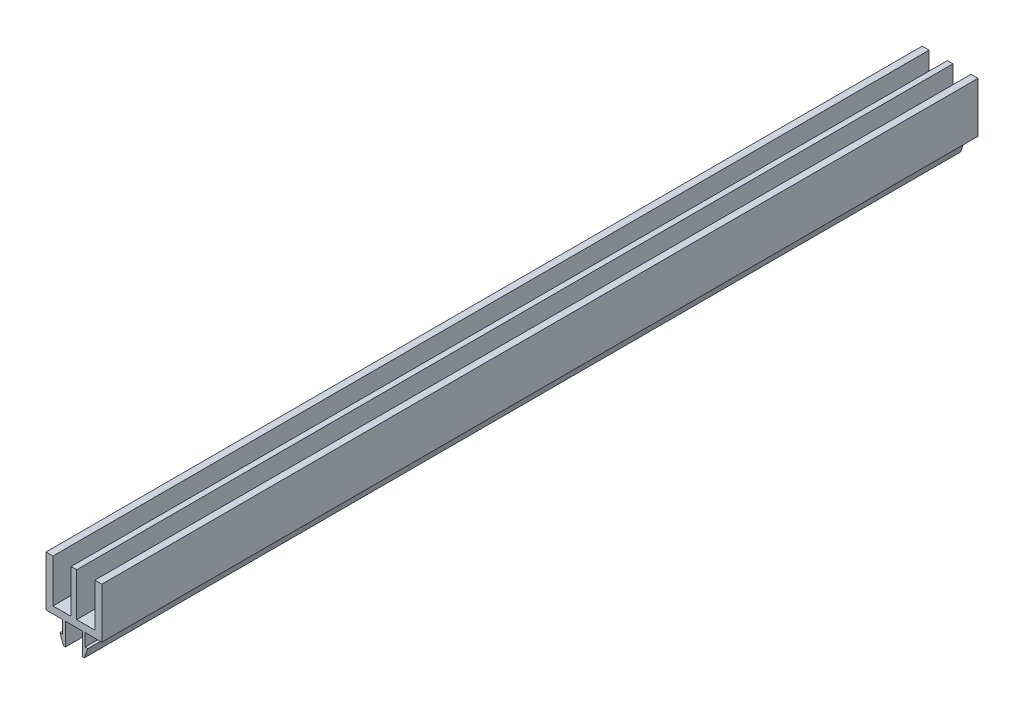
ISO-10303-21;
HEADER;
FILE_DESCRIPTION(('STEP AP214'),'2;1');
FILE_NAME('part.step','',(''),(''),'','','');
FILE_SCHEMA(('AUTOMOTIVE_DESIGN { 1 0 10303 214 1 1 1 1 }'));
ENDSEC;
DATA;
#1=APPLICATION_CONTEXT('core data for automotive mechanical design processes');
#2=APPLICATION_PROTOCOL_DEFINITION('international standard','automotive_design',2000,#1);
#3=PRODUCT_CONTEXT('',#1,'mechanical');
#4=PRODUCT('Part','Part','',(#3));
#5=PRODUCT_RELATED_PRODUCT_CATEGORY('part','',(#4));
#6=PRODUCT_DEFINITION_FORMATION('','',#4);
#7=PRODUCT_DEFINITION_CONTEXT('part definition',#1,'design');
#8=PRODUCT_DEFINITION('design','',#6,#7);
#9=PRODUCT_DEFINITION_SHAPE('','',#8);
#10=(LENGTH_UNIT() NAMED_UNIT(*) SI_UNIT(.MILLI.,.METRE.));
#11=(NAMED_UNIT(*) PLANE_ANGLE_UNIT() SI_UNIT($,.RADIAN.));
#12=(NAMED_UNIT(*) SI_UNIT($,.STERADIAN.) SOLID_ANGLE_UNIT());
#13=UNCERTAINTY_MEASURE_WITH_UNIT(LENGTH_MEASURE(1.E-05),#10,'distance_accuracy_value','');
#14=(GEOMETRIC_REPRESENTATION_CONTEXT(3) GLOBAL_UNCERTAINTY_ASSIGNED_CONTEXT((#13)) GLOBAL_UNIT_ASSIGNED_CONTEXT((#10,
#11,#12)) REPRESENTATION_CONTEXT('',''));
#15=CARTESIAN_POINT('',(0.,0.,0.));
#16=DIRECTION('',(0.,0.,1.));
#17=DIRECTION('',(1.,0.,0.));
#18=AXIS2_PLACEMENT_3D('',#15,#16,#17);
#19=CARTESIAN_POINT('',(-1.,17.9999999975,-264.));
#20=DIRECTION('',(-1.,0.,0.));
#21=DIRECTION('',(0.,-1.,0.));
#22=AXIS2_PLACEMENT_3D('',#19,#20,#21);
#23=PLANE('',#22);
#24=DIRECTION('',(0.,-1.,0.));
#25=VECTOR('',#24,1.);
#26=CARTESIAN_POINT('',(-1.,17.9999999975,50.));
#27=LINE('',#26,#25);
#28=CARTESIAN_POINT('',(-1.,17.9999999975,50.));
#29=VERTEX_POINT('',#28);
#30=CARTESIAN_POINT('',(-1.,2.4999999995,50.));
#31=VERTEX_POINT('',#30);
#32=EDGE_CURVE('E226',#29,#31,#27,.T.);
#33=ORIENTED_EDGE('',*,*,#32,.F.);
#34=DIRECTION('',(0.,0.,1.));
#35=VECTOR('',#34,1.);
#36=CARTESIAN_POINT('',(-1.,17.9999999975,-264.));
#37=LINE('',#36,#35);
#38=CARTESIAN_POINT('',(-1.,17.9999999975,-264.));
#39=VERTEX_POINT('',#38);
#40=EDGE_CURVE('E11',#39,#29,#37,.T.);
#41=ORIENTED_EDGE('',*,*,#40,.F.);
#42=DIRECTION('',(0.,-1.,0.));
#43=VECTOR('',#42,1.);
#44=CARTESIAN_POINT('',(-1.,17.9999999975,-264.));
#45=LINE('',#44,#43);
#46=CARTESIAN_POINT('',(-1.,2.4999999995,-264.));
#47=VERTEX_POINT('',#46);
#48=EDGE_CURVE('E294',#39,#47,#45,.T.);
#49=ORIENTED_EDGE('',*,*,#48,.T.);
#50=DIRECTION('',(0.,0.,1.));
#51=VECTOR('',#50,1.);
#52=CARTESIAN_POINT('',(-1.,2.4999999995,-264.));
#53=LINE('',#52,#51);
#54=EDGE_CURVE('E36',#47,#31,#53,.T.);
#55=ORIENTED_EDGE('',*,*,#54,.T.);
#56=EDGE_LOOP('',(#33,#41,#49,#55));
#57=FACE_BOUND('',#56,.T.);
#58=ADVANCED_FACE('F33',(#57),#23,.T.);
#59=CARTESIAN_POINT('',(0.999999999999998,17.9999999975,-264.));
#60=DIRECTION('',(0.,1.,0.));
#61=DIRECTION('',(0.,0.,1.));
#62=AXIS2_PLACEMENT_3D('',#59,#60,#61);
#63=PLANE('',#62);
#64=DIRECTION('',(-1.,0.,0.));
#65=VECTOR('',#64,1.);
#66=CARTESIAN_POINT('',(0.999999999999998,17.9999999975,50.));
#67=LINE('',#66,#65);
#68=CARTESIAN_POINT('',(0.999999999999998,17.9999999975,50.));
#69=VERTEX_POINT('',#68);
#70=EDGE_CURVE('E292',#69,#29,#67,.T.);
#71=ORIENTED_EDGE('',*,*,#70,.F.);
#72=DIRECTION('',(0.,0.,1.));
#73=VECTOR('',#72,1.);
#74=CARTESIAN_POINT('',(0.999999999999998,17.9999999975,-264.));
#75=LINE('',#74,#73);
#76=CARTESIAN_POINT('',(0.999999999999998,17.9999999975,-264.));
#77=VERTEX_POINT('',#76);
#78=EDGE_CURVE('E42',#77,#69,#75,.T.);
#79=ORIENTED_EDGE('',*,*,#78,.F.);
#80=DIRECTION('',(-1.,0.,0.));
#81=VECTOR('',#80,1.);
#82=CARTESIAN_POINT('',(0.999999999999998,17.9999999975,-264.));
#83=LINE('',#82,#81);
#84=EDGE_CURVE('E216',#77,#39,#83,.T.);
#85=ORIENTED_EDGE('',*,*,#84,.T.);
#86=ORIENTED_EDGE('',*,*,#40,.T.);
#87=EDGE_LOOP('',(#71,#79,#85,#86));
#88=FACE_BOUND('',#87,.T.);
#89=ADVANCED_FACE('F338',(#88),#63,.T.);
#90=CARTESIAN_POINT('',(0.999999999999998,2.4999999995,-264.));
#91=DIRECTION('',(1.,0.,0.));
#92=DIRECTION('',(0.,0.,-1.));
#93=AXIS2_PLACEMENT_3D('',#90,#91,#92);
#94=PLANE('',#93);
#95=DIRECTION('',(0.,1.,0.));
#96=VECTOR('',#95,1.);
#97=CARTESIAN_POINT('',(0.999999999999998,2.4999999995,50.));
#98=LINE('',#97,#96);
#99=CARTESIAN_POINT('',(0.999999999999998,2.4999999995,50.));
#100=VERTEX_POINT('',#99);
#101=EDGE_CURVE('E203',#100,#69,#98,.T.);
#102=ORIENTED_EDGE('',*,*,#101,.F.);
#103=DIRECTION('',(0.,0.,1.));
#104=VECTOR('',#103,1.);
#105=CARTESIAN_POINT('',(0.999999999999998,2.4999999995,-264.));
#106=LINE('',#105,#104);
#107=CARTESIAN_POINT('',(0.999999999999998,2.4999999995,-264.));
#108=VERTEX_POINT('',#107);
#109=EDGE_CURVE('E198',#108,#100,#106,.T.);
#110=ORIENTED_EDGE('',*,*,#109,.F.);
#111=DIRECTION('',(0.,1.,0.));
#112=VECTOR('',#111,1.);
#113=CARTESIAN_POINT('',(0.999999999999998,2.4999999995,-264.));
#114=LINE('',#113,#112);
#115=EDGE_CURVE('E201',#108,#77,#114,.T.);
#116=ORIENTED_EDGE('',*,*,#115,.T.);
#117=ORIENTED_EDGE('',*,*,#78,.T.);
#118=EDGE_LOOP('',(#102,#110,#116,#117));
#119=FACE_BOUND('',#118,.T.);
#120=ADVANCED_FACE('F200',(#119),#94,.T.);
#121=CARTESIAN_POINT('',(7.5,2.4999999995,-264.));
#122=DIRECTION('',(0.,1.,0.));
#123=DIRECTION('',(-1.,0.,0.));
#124=AXIS2_PLACEMENT_3D('',#121,#122,#123);
#125=PLANE('',#124);
#126=DIRECTION('',(-1.,0.,0.));
#127=VECTOR('',#126,1.);
#128=CARTESIAN_POINT('',(7.5,2.4999999995,50.));
#129=LINE('',#128,#127);
#130=CARTESIAN_POINT('',(7.5,2.4999999995,50.));
#131=VERTEX_POINT('',#130);
#132=EDGE_CURVE('E289',#131,#100,#129,.T.);
#133=ORIENTED_EDGE('',*,*,#132,.F.);
#134=DIRECTION('',(0.,0.,1.));
#135=VECTOR('',#134,1.);
#136=CARTESIAN_POINT('',(7.5,2.4999999995,-264.));
#137=LINE('',#136,#135);
#138=CARTESIAN_POINT('',(7.5,2.4999999995,-264.));
#139=VERTEX_POINT('',#138);
#140=EDGE_CURVE('E208',#139,#131,#137,.T.);
#141=ORIENTED_EDGE('',*,*,#140,.F.);
#142=DIRECTION('',(-1.,0.,0.));
#143=VECTOR('',#142,1.);
#144=CARTESIAN_POINT('',(7.5,2.4999999995,-264.));
#145=LINE('',#144,#143);
#146=EDGE_CURVE('E214',#139,#108,#145,.T.);
#147=ORIENTED_EDGE('',*,*,#146,.T.);
#148=ORIENTED_EDGE('',*,*,#109,.T.);
#149=EDGE_LOOP('',(#133,#141,#147,#148));
#150=FACE_BOUND('',#149,.T.);
#151=ADVANCED_FACE('F218',(#150),#125,.T.);
#152=CARTESIAN_POINT('',(7.5,17.9999999975,-264.));
#153=DIRECTION('',(-1.,0.,0.));
#154=DIRECTION('',(0.,-1.,0.));
#155=AXIS2_PLACEMENT_3D('',#152,#153,#154);
#156=PLANE('',#155);
#157=DIRECTION('',(0.,-1.,0.));
#158=VECTOR('',#157,1.);
#159=CARTESIAN_POINT('',(7.5,17.9999999975,50.));
#160=LINE('',#159,#158);
#161=CARTESIAN_POINT('',(7.5,17.9999999975,50.));
#162=VERTEX_POINT('',#161);
#163=EDGE_CURVE('E286',#162,#131,#160,.T.);
#164=ORIENTED_EDGE('',*,*,#163,.F.);
#165=DIRECTION('',(0.,0.,1.));
#166=VECTOR('',#165,1.);
#167=CARTESIAN_POINT('',(7.5,17.9999999975,-264.));
#168=LINE('',#167,#166);
#169=CARTESIAN_POINT('',(7.5,17.9999999975,-264.));
#170=VERTEX_POINT('',#169);
#171=EDGE_CURVE('E298',#170,#162,#168,.T.);
#172=ORIENTED_EDGE('',*,*,#171,.F.);
#173=DIRECTION('',(0.,-1.,0.));
#174=VECTOR('',#173,1.);
#175=CARTESIAN_POINT('',(7.5,17.9999999975,-264.));
#176=LINE('',#175,#174);
#177=EDGE_CURVE('E219',#170,#139,#176,.T.);
#178=ORIENTED_EDGE('',*,*,#177,.T.);
#179=ORIENTED_EDGE('',*,*,#140,.T.);
#180=EDGE_LOOP('',(#164,#172,#178,#179));
#181=FACE_BOUND('',#180,.T.);
#182=ADVANCED_FACE('F351',(#181),#156,.T.);
#183=CARTESIAN_POINT('',(10.,17.9999999975,-264.));
#184=DIRECTION('',(0.,1.,0.));
#185=DIRECTION('',(0.,0.,1.));
#186=AXIS2_PLACEMENT_3D('',#183,#184,#185);
#187=PLANE('',#186);
#188=DIRECTION('',(-1.,0.,0.));
#189=VECTOR('',#188,1.);
#190=CARTESIAN_POINT('',(10.,17.9999999975,50.));
#191=LINE('',#190,#189);
#192=CARTESIAN_POINT('',(10.,17.9999999975,50.));
#193=VERTEX_POINT('',#192);
#194=EDGE_CURVE('E283',#193,#162,#191,.T.);
#195=ORIENTED_EDGE('',*,*,#194,.F.);
#196=DIRECTION('',(0.,0.,1.));
#197=VECTOR('',#196,1.);
#198=CARTESIAN_POINT('',(10.,17.9999999975,-264.));
#199=LINE('',#198,#197);
#200=CARTESIAN_POINT('',(10.,17.9999999975,-264.));
#201=VERTEX_POINT('',#200);
#202=EDGE_CURVE('E300',#201,#193,#199,.T.);
#203=ORIENTED_EDGE('',*,*,#202,.F.);
#204=DIRECTION('',(-1.,0.,0.));
#205=VECTOR('',#204,1.);
#206=CARTESIAN_POINT('',(10.,17.9999999975,-264.));
#207=LINE('',#206,#205);
#208=EDGE_CURVE('E221',#201,#170,#207,.T.);
#209=ORIENTED_EDGE('',*,*,#208,.T.);
#210=ORIENTED_EDGE('',*,*,#171,.T.);
#211=EDGE_LOOP('',(#195,#203,#209,#210));
#212=FACE_BOUND('',#211,.T.);
#213=ADVANCED_FACE('F354',(#212),#187,.T.);
#214=CARTESIAN_POINT('',(10.,-4.99999828349541E-10,-264.));
#215=DIRECTION('',(1.,0.,0.));
#216=DIRECTION('',(0.,0.,-1.));
#217=AXIS2_PLACEMENT_3D('',#214,#215,#216);
#218=PLANE('',#217);
#219=DIRECTION('',(0.,1.,0.));
#220=VECTOR('',#219,1.);
#221=CARTESIAN_POINT('',(10.,-4.99999828349541E-10,50.));
#222=LINE('',#221,#220);
#223=CARTESIAN_POINT('',(10.,-4.99999828349541E-10,50.));
#224=VERTEX_POINT('',#223);
#225=EDGE_CURVE('E280',#224,#193,#222,.T.);
#226=ORIENTED_EDGE('',*,*,#225,.F.);
#227=DIRECTION('',(0.,0.,1.));
#228=VECTOR('',#227,1.);
#229=CARTESIAN_POINT('',(10.,-4.99999828349541E-10,-264.));
#230=LINE('',#229,#228);
#231=CARTESIAN_POINT('',(10.,-4.99999828349541E-10,-264.));
#232=VERTEX_POINT('',#231);
#233=EDGE_CURVE('E302',#232,#224,#230,.T.);
#234=ORIENTED_EDGE('',*,*,#233,.F.);
#235=DIRECTION('',(0.,1.,0.));
#236=VECTOR('',#235,1.);
#237=CARTESIAN_POINT('',(10.,-4.99999828349541E-10,-264.));
#238=LINE('',#237,#236);
#239=EDGE_CURVE('E644',#232,#201,#238,.T.);
#240=ORIENTED_EDGE('',*,*,#239,.T.);
#241=ORIENTED_EDGE('',*,*,#202,.T.);
#242=EDGE_LOOP('',(#226,#234,#240,#241));
#243=FACE_BOUND('',#242,.T.);
#244=ADVANCED_FACE('F358',(#243),#218,.T.);
#245=CARTESIAN_POINT('',(4.,-4.99999998002099E-10,-264.));
#246=DIRECTION('',(0.,-1.,0.));
#247=DIRECTION('',(1.,0.,0.));
#248=AXIS2_PLACEMENT_3D('',#245,#246,#247);
#249=PLANE('',#248);
#250=DIRECTION('',(1.,0.,0.));
#251=VECTOR('',#250,1.);
#252=CARTESIAN_POINT('',(4.,-4.99999998002099E-10,50.));
#253=LINE('',#252,#251);
#254=CARTESIAN_POINT('',(4.,-4.99999998002099E-10,50.));
#255=VERTEX_POINT('',#254);
#256=EDGE_CURVE('E277',#255,#224,#253,.T.);
#257=ORIENTED_EDGE('',*,*,#256,.F.);
#258=DIRECTION('',(0.,0.,1.));
#259=VECTOR('',#258,1.);
#260=CARTESIAN_POINT('',(4.,-4.99999998002099E-10,-264.));
#261=LINE('',#260,#259);
#262=CARTESIAN_POINT('',(4.,-4.99999998002099E-10,-264.));
#263=VERTEX_POINT('',#262);
#264=EDGE_CURVE('E304',#263,#255,#261,.T.);
#265=ORIENTED_EDGE('',*,*,#264,.F.);
#266=DIRECTION('',(1.,0.,0.));
#267=VECTOR('',#266,1.);
#268=CARTESIAN_POINT('',(4.,-4.99999998002099E-10,-264.));
#269=LINE('',#268,#267);
#270=EDGE_CURVE('E648',#263,#232,#269,.T.);
#271=ORIENTED_EDGE('',*,*,#270,.T.);
#272=ORIENTED_EDGE('',*,*,#233,.T.);
#273=EDGE_LOOP('',(#257,#265,#271,#272));
#274=FACE_BOUND('',#273,.T.);
#275=ADVANCED_FACE('F362',(#274),#249,.T.);
#276=CARTESIAN_POINT('',(4.,-4.5,-264.));
#277=DIRECTION('',(1.,0.,0.));
#278=DIRECTION('',(0.,0.,-1.));
#279=AXIS2_PLACEMENT_3D('',#276,#277,#278);
#280=PLANE('',#279);
#281=DIRECTION('',(0.,1.,0.));
#282=VECTOR('',#281,1.);
#283=CARTESIAN_POINT('',(4.,-4.5,50.));
#284=LINE('',#283,#282);
#285=CARTESIAN_POINT('',(4.,-4.5,50.));
#286=VERTEX_POINT('',#285);
#287=EDGE_CURVE('E274',#286,#255,#284,.T.);
#288=ORIENTED_EDGE('',*,*,#287,.F.);
#289=DIRECTION('',(0.,0.,1.));
#290=VECTOR('',#289,1.);
#291=CARTESIAN_POINT('',(4.,-4.5,-264.));
#292=LINE('',#291,#290);
#293=CARTESIAN_POINT('',(4.,-4.5,-264.));
#294=VERTEX_POINT('',#293);
#295=EDGE_CURVE('E306',#294,#286,#292,.T.);
#296=ORIENTED_EDGE('',*,*,#295,.F.);
#297=DIRECTION('',(0.,1.,0.));
#298=VECTOR('',#297,1.);
#299=CARTESIAN_POINT('',(4.,-4.5,-264.));
#300=LINE('',#299,#298);
#301=EDGE_CURVE('E637',#294,#263,#300,.T.);
#302=ORIENTED_EDGE('',*,*,#301,.T.);
#303=ORIENTED_EDGE('',*,*,#264,.T.);
#304=EDGE_LOOP('',(#288,#296,#302,#303));
#305=FACE_BOUND('',#304,.T.);
#306=ADVANCED_FACE('F366',(#305),#280,.T.);
#307=CARTESIAN_POINT('',(5.,-4.5,-264.));
#308=DIRECTION('',(0.,1.,0.));
#309=DIRECTION('',(0.,0.,1.));
#310=AXIS2_PLACEMENT_3D('',#307,#308,#309);
#311=PLANE('',#310);
#312=DIRECTION('',(-1.,0.,0.));
#313=VECTOR('',#312,1.);
#314=CARTESIAN_POINT('',(5.,-4.5,50.));
#315=LINE('',#314,#313);
#316=CARTESIAN_POINT('',(5.,-4.5,50.));
#317=VERTEX_POINT('',#316);
#318=EDGE_CURVE('E271',#317,#286,#315,.T.);
#319=ORIENTED_EDGE('',*,*,#318,.F.);
#320=DIRECTION('',(0.,0.,1.));
#321=VECTOR('',#320,1.);
#322=CARTESIAN_POINT('',(5.,-4.5,-264.));
#323=LINE('',#322,#321);
#324=CARTESIAN_POINT('',(5.,-4.5,-264.));
#325=VERTEX_POINT('',#324);
#326=EDGE_CURVE('E308',#325,#317,#323,.T.);
#327=ORIENTED_EDGE('',*,*,#326,.F.);
#328=DIRECTION('',(-1.,0.,0.));
#329=VECTOR('',#328,1.);
#330=CARTESIAN_POINT('',(5.,-4.5,-264.));
#331=LINE('',#330,#329);
#332=EDGE_CURVE('E633',#325,#294,#331,.T.);
#333=ORIENTED_EDGE('',*,*,#332,.T.);
#334=ORIENTED_EDGE('',*,*,#295,.T.);
#335=EDGE_LOOP('',(#319,#327,#333,#334));
#336=FACE_BOUND('',#335,.T.);
#337=ADVANCED_FACE('F370',(#336),#311,.T.);
#338=CARTESIAN_POINT('',(3.75,-8.,-264.));
#339=DIRECTION('',(0.941741911594838,-0.336336396998157,0.));
#340=DIRECTION('',(0.336336396998157,0.941741911594837,0.));
#341=AXIS2_PLACEMENT_3D('',#338,#339,#340);
#342=PLANE('',#341);
#343=DIRECTION('',(0.336336396998157,0.941741911594837,0.));
#344=VECTOR('',#343,1.);
#345=CARTESIAN_POINT('',(3.75,-8.,50.));
#346=LINE('',#345,#344);
#347=CARTESIAN_POINT('',(3.75,-8.,50.));
#348=VERTEX_POINT('',#347);
#349=EDGE_CURVE('E268',#348,#317,#346,.T.);
#350=ORIENTED_EDGE('',*,*,#349,.F.);
#351=DIRECTION('',(0.,0.,1.));
#352=VECTOR('',#351,1.);
#353=CARTESIAN_POINT('',(3.75,-8.,-264.));
#354=LINE('',#353,#352);
#355=CARTESIAN_POINT('',(3.75,-8.,-264.));
#356=VERTEX_POINT('',#355);
#357=EDGE_CURVE('E310',#356,#348,#354,.T.);
#358=ORIENTED_EDGE('',*,*,#357,.F.);
#359=DIRECTION('',(0.336336396998157,0.941741911594837,0.));
#360=VECTOR('',#359,1.);
#361=CARTESIAN_POINT('',(3.75,-8.,-264.));
#362=LINE('',#361,#360);
#363=EDGE_CURVE('E654',#356,#325,#362,.T.);
#364=ORIENTED_EDGE('',*,*,#363,.T.);
#365=ORIENTED_EDGE('',*,*,#326,.T.);
#366=EDGE_LOOP('',(#350,#358,#364,#365));
#367=FACE_BOUND('',#366,.T.);
#368=ADVANCED_FACE('F374',(#367),#342,.T.);
#369=CARTESIAN_POINT('',(3.,-8.,-264.));
#370=DIRECTION('',(0.,-1.,0.));
#371=DIRECTION('',(0.,0.,-1.));
#372=AXIS2_PLACEMENT_3D('',#369,#370,#371);
#373=PLANE('',#372);
#374=DIRECTION('',(1.,0.,0.));
#375=VECTOR('',#374,1.);
#376=CARTESIAN_POINT('',(3.,-8.,50.));
#377=LINE('',#376,#375);
#378=CARTESIAN_POINT('',(3.,-8.,50.));
#379=VERTEX_POINT('',#378);
#380=EDGE_CURVE('E265',#379,#348,#377,.T.);
#381=ORIENTED_EDGE('',*,*,#380,.F.);
#382=DIRECTION('',(0.,0.,1.));
#383=VECTOR('',#382,1.);
#384=CARTESIAN_POINT('',(3.,-8.,-264.));
#385=LINE('',#384,#383);
#386=CARTESIAN_POINT('',(3.,-8.,-264.));
#387=VERTEX_POINT('',#386);
#388=EDGE_CURVE('E312',#387,#379,#385,.T.);
#389=ORIENTED_EDGE('',*,*,#388,.F.);
#390=DIRECTION('',(1.,0.,0.));
#391=VECTOR('',#390,1.);
#392=CARTESIAN_POINT('',(3.,-8.,-264.));
#393=LINE('',#392,#391);
#394=EDGE_CURVE('E626',#387,#356,#393,.T.);
#395=ORIENTED_EDGE('',*,*,#394,.T.);
#396=ORIENTED_EDGE('',*,*,#357,.T.);
#397=EDGE_LOOP('',(#381,#389,#395,#396));
#398=FACE_BOUND('',#397,.T.);
#399=ADVANCED_FACE('F378',(#398),#373,.T.);
#400=CARTESIAN_POINT('',(3.,-4.9999985194348E-10,-264.));
#401=DIRECTION('',(-1.,0.,0.));
#402=DIRECTION('',(0.,0.,1.));
#403=AXIS2_PLACEMENT_3D('',#400,#401,#402);
#404=PLANE('',#403);
#405=DIRECTION('',(0.,-1.,0.));
#406=VECTOR('',#405,1.);
#407=CARTESIAN_POINT('',(3.,-4.9999985194348E-10,50.));
#408=LINE('',#407,#406);
#409=CARTESIAN_POINT('',(3.,-4.9999985194348E-10,50.));
#410=VERTEX_POINT('',#409);
#411=EDGE_CURVE('E262',#410,#379,#408,.T.);
#412=ORIENTED_EDGE('',*,*,#411,.F.);
#413=DIRECTION('',(0.,0.,1.));
#414=VECTOR('',#413,1.);
#415=CARTESIAN_POINT('',(3.,-4.9999985194348E-10,-264.));
#416=LINE('',#415,#414);
#417=CARTESIAN_POINT('',(3.,-4.9999985194348E-10,-264.));
#418=VERTEX_POINT('',#417);
#419=EDGE_CURVE('E314',#418,#410,#416,.T.);
#420=ORIENTED_EDGE('',*,*,#419,.F.);
#421=DIRECTION('',(0.,-1.,0.));
#422=VECTOR('',#421,1.);
#423=CARTESIAN_POINT('',(3.,-4.9999985194348E-10,-264.));
#424=LINE('',#423,#422);
#425=EDGE_CURVE('E622',#418,#387,#424,.T.);
#426=ORIENTED_EDGE('',*,*,#425,.T.);
#427=ORIENTED_EDGE('',*,*,#388,.T.);
#428=EDGE_LOOP('',(#412,#420,#426,#427));
#429=FACE_BOUND('',#428,.T.);
#430=ADVANCED_FACE('F382',(#429),#404,.T.);
#431=CARTESIAN_POINT('',(-3.,-4.99999455901012E-10,-264.));
#432=DIRECTION('',(0.,-1.,0.));
#433=DIRECTION('',(1.,0.,0.));
#434=AXIS2_PLACEMENT_3D('',#431,#432,#433);
#435=PLANE('',#434);
#436=DIRECTION('',(1.,0.,0.));
#437=VECTOR('',#436,1.);
#438=CARTESIAN_POINT('',(-3.,-4.99999455901012E-10,50.));
#439=LINE('',#438,#437);
#440=CARTESIAN_POINT('',(-3.,-4.99999455901012E-10,50.));
#441=VERTEX_POINT('',#440);
#442=EDGE_CURVE('E259',#441,#410,#439,.T.);
#443=ORIENTED_EDGE('',*,*,#442,.F.);
#444=DIRECTION('',(0.,0.,1.));
#445=VECTOR('',#444,1.);
#446=CARTESIAN_POINT('',(-3.,-4.99999455901012E-10,-264.));
#447=LINE('',#446,#445);
#448=CARTESIAN_POINT('',(-3.,-4.99999455901012E-10,-264.));
#449=VERTEX_POINT('',#448);
#450=EDGE_CURVE('E316',#449,#441,#447,.T.);
#451=ORIENTED_EDGE('',*,*,#450,.F.);
#452=DIRECTION('',(1.,0.,0.));
#453=VECTOR('',#452,1.);
#454=CARTESIAN_POINT('',(-3.,-4.99999455901012E-10,-264.));
#455=LINE('',#454,#453);
#456=EDGE_CURVE('E658',#449,#418,#455,.T.);
#457=ORIENTED_EDGE('',*,*,#456,.T.);
#458=ORIENTED_EDGE('',*,*,#419,.T.);
#459=EDGE_LOOP('',(#443,#451,#457,#458));
#460=FACE_BOUND('',#459,.T.);
#461=ADVANCED_FACE('F386',(#460),#435,.T.);
#462=CARTESIAN_POINT('',(-3.,-8.,-264.));
#463=DIRECTION('',(1.,0.,0.));
#464=DIRECTION('',(0.,0.,-1.));
#465=AXIS2_PLACEMENT_3D('',#462,#463,#464);
#466=PLANE('',#465);
#467=DIRECTION('',(0.,1.,0.));
#468=VECTOR('',#467,1.);
#469=CARTESIAN_POINT('',(-3.,-8.,50.));
#470=LINE('',#469,#468);
#471=CARTESIAN_POINT('',(-3.,-8.,50.));
#472=VERTEX_POINT('',#471);
#473=EDGE_CURVE('E256',#472,#441,#470,.T.);
#474=ORIENTED_EDGE('',*,*,#473,.F.);
#475=DIRECTION('',(0.,0.,1.));
#476=VECTOR('',#475,1.);
#477=CARTESIAN_POINT('',(-3.,-8.,-264.));
#478=LINE('',#477,#476);
#479=CARTESIAN_POINT('',(-3.,-8.,-264.));
#480=VERTEX_POINT('',#479);
#481=EDGE_CURVE('E318',#480,#472,#478,.T.);
#482=ORIENTED_EDGE('',*,*,#481,.F.);
#483=DIRECTION('',(0.,1.,0.));
#484=VECTOR('',#483,1.);
#485=CARTESIAN_POINT('',(-3.,-8.,-264.));
#486=LINE('',#485,#484);
#487=EDGE_CURVE('E615',#480,#449,#486,.T.);
#488=ORIENTED_EDGE('',*,*,#487,.T.);
#489=ORIENTED_EDGE('',*,*,#450,.T.);
#490=EDGE_LOOP('',(#474,#482,#488,#489));
#491=FACE_BOUND('',#490,.T.);
#492=ADVANCED_FACE('F390',(#491),#466,.T.);
#493=CARTESIAN_POINT('',(-3.75,-8.,-264.));
#494=DIRECTION('',(0.,-1.,0.));
#495=DIRECTION('',(0.,0.,-1.));
#496=AXIS2_PLACEMENT_3D('',#493,#494,#495);
#497=PLANE('',#496);
#498=DIRECTION('',(1.,0.,0.));
#499=VECTOR('',#498,1.);
#500=CARTESIAN_POINT('',(-3.75,-8.,50.));
#501=LINE('',#500,#499);
#502=CARTESIAN_POINT('',(-3.75,-8.,50.));
#503=VERTEX_POINT('',#502);
#504=EDGE_CURVE('E253',#503,#472,#501,.T.);
#505=ORIENTED_EDGE('',*,*,#504,.F.);
#506=DIRECTION('',(0.,0.,1.));
#507=VECTOR('',#506,1.);
#508=CARTESIAN_POINT('',(-3.75,-8.,-264.));
#509=LINE('',#508,#507);
#510=CARTESIAN_POINT('',(-3.75,-8.,-264.));
#511=VERTEX_POINT('',#510);
#512=EDGE_CURVE('E320',#511,#503,#509,.T.);
#513=ORIENTED_EDGE('',*,*,#512,.F.);
#514=DIRECTION('',(1.,0.,0.));
#515=VECTOR('',#514,1.);
#516=CARTESIAN_POINT('',(-3.75,-8.,-264.));
#517=LINE('',#516,#515);
#518=EDGE_CURVE('E611',#511,#480,#517,.T.);
#519=ORIENTED_EDGE('',*,*,#518,.T.);
#520=ORIENTED_EDGE('',*,*,#481,.T.);
#521=EDGE_LOOP('',(#505,#513,#519,#520));
#522=FACE_BOUND('',#521,.T.);
#523=ADVANCED_FACE('F394',(#522),#497,.T.);
#524=CARTESIAN_POINT('',(-5.,-4.5,-264.));
#525=DIRECTION('',(-0.941741911594837,-0.336336396998156,0.));
#526=DIRECTION('',(0.336336396998156,-0.941741911594838,0.));
#527=AXIS2_PLACEMENT_3D('',#524,#525,#526);
#528=PLANE('',#527);
#529=DIRECTION('',(0.336336396998156,-0.941741911594837,0.));
#530=VECTOR('',#529,1.);
#531=CARTESIAN_POINT('',(-5.,-4.5,50.));
#532=LINE('',#531,#530);
#533=CARTESIAN_POINT('',(-5.,-4.5,50.));
#534=VERTEX_POINT('',#533);
#535=EDGE_CURVE('E250',#534,#503,#532,.T.);
#536=ORIENTED_EDGE('',*,*,#535,.F.);
#537=DIRECTION('',(0.,0.,1.));
#538=VECTOR('',#537,1.);
#539=CARTESIAN_POINT('',(-5.,-4.5,-264.));
#540=LINE('',#539,#538);
#541=CARTESIAN_POINT('',(-5.,-4.5,-264.));
#542=VERTEX_POINT('',#541);
#543=EDGE_CURVE('E322',#542,#534,#540,.T.);
#544=ORIENTED_EDGE('',*,*,#543,.F.);
#545=DIRECTION('',(0.336336396998156,-0.941741911594837,0.));
#546=VECTOR('',#545,1.);
#547=CARTESIAN_POINT('',(-5.,-4.5,-264.));
#548=LINE('',#547,#546);
#549=EDGE_CURVE('E662',#542,#511,#548,.T.);
#550=ORIENTED_EDGE('',*,*,#549,.T.);
#551=ORIENTED_EDGE('',*,*,#512,.T.);
#552=EDGE_LOOP('',(#536,#544,#550,#551));
#553=FACE_BOUND('',#552,.T.);
#554=ADVANCED_FACE('F398',(#553),#528,.T.);
#555=CARTESIAN_POINT('',(-4.,-4.5,-264.));
#556=DIRECTION('',(0.,1.,0.));
#557=DIRECTION('',(0.,0.,1.));
#558=AXIS2_PLACEMENT_3D('',#555,#556,#557);
#559=PLANE('',#558);
#560=DIRECTION('',(-1.,0.,0.));
#561=VECTOR('',#560,1.);
#562=CARTESIAN_POINT('',(-4.,-4.5,50.));
#563=LINE('',#562,#561);
#564=CARTESIAN_POINT('',(-4.,-4.5,50.));
#565=VERTEX_POINT('',#564);
#566=EDGE_CURVE('E247',#565,#534,#563,.T.);
#567=ORIENTED_EDGE('',*,*,#566,.F.);
#568=DIRECTION('',(0.,0.,1.));
#569=VECTOR('',#568,1.);
#570=CARTESIAN_POINT('',(-4.,-4.5,-264.));
#571=LINE('',#570,#569);
#572=CARTESIAN_POINT('',(-4.,-4.5,-264.));
#573=VERTEX_POINT('',#572);
#574=EDGE_CURVE('E324',#573,#565,#571,.T.);
#575=ORIENTED_EDGE('',*,*,#574,.F.);
#576=DIRECTION('',(-1.,0.,0.));
#577=VECTOR('',#576,1.);
#578=CARTESIAN_POINT('',(-4.,-4.5,-264.));
#579=LINE('',#578,#577);
#580=EDGE_CURVE('E604',#573,#542,#579,.T.);
#581=ORIENTED_EDGE('',*,*,#580,.T.);
#582=ORIENTED_EDGE('',*,*,#543,.T.);
#583=EDGE_LOOP('',(#567,#575,#581,#582));
#584=FACE_BOUND('',#583,.T.);
#585=ADVANCED_FACE('F402',(#584),#559,.T.);
#586=CARTESIAN_POINT('',(-4.,-4.9999985194348E-10,-264.));
#587=DIRECTION('',(-1.,0.,0.));
#588=DIRECTION('',(0.,0.,1.));
#589=AXIS2_PLACEMENT_3D('',#586,#587,#588);
#590=PLANE('',#589);
#591=DIRECTION('',(0.,-1.,0.));
#592=VECTOR('',#591,1.);
#593=CARTESIAN_POINT('',(-4.,-4.9999985194348E-10,50.));
#594=LINE('',#593,#592);
#595=CARTESIAN_POINT('',(-4.,-4.9999985194348E-10,50.));
#596=VERTEX_POINT('',#595);
#597=EDGE_CURVE('E244',#596,#565,#594,.T.);
#598=ORIENTED_EDGE('',*,*,#597,.F.);
#599=DIRECTION('',(0.,0.,1.));
#600=VECTOR('',#599,1.);
#601=CARTESIAN_POINT('',(-4.,-4.9999985194348E-10,-264.));
#602=LINE('',#601,#600);
#603=CARTESIAN_POINT('',(-4.,-4.9999985194348E-10,-264.));
#604=VERTEX_POINT('',#603);
#605=EDGE_CURVE('E326',#604,#596,#602,.T.);
#606=ORIENTED_EDGE('',*,*,#605,.F.);
#607=DIRECTION('',(0.,-1.,0.));
#608=VECTOR('',#607,1.);
#609=CARTESIAN_POINT('',(-4.,-4.9999985194348E-10,-264.));
#610=LINE('',#609,#608);
#611=EDGE_CURVE('E600',#604,#573,#610,.T.);
#612=ORIENTED_EDGE('',*,*,#611,.T.);
#613=ORIENTED_EDGE('',*,*,#574,.T.);
#614=EDGE_LOOP('',(#598,#606,#612,#613));
#615=FACE_BOUND('',#614,.T.);
#616=ADVANCED_FACE('F406',(#615),#590,.T.);
#617=CARTESIAN_POINT('',(-10.,-4.99999719929324E-10,-264.));
#618=DIRECTION('',(0.,-1.,0.));
#619=DIRECTION('',(1.,0.,0.));
#620=AXIS2_PLACEMENT_3D('',#617,#618,#619);
#621=PLANE('',#620);
#622=DIRECTION('',(1.,0.,0.));
#623=VECTOR('',#622,1.);
#624=CARTESIAN_POINT('',(-10.,-4.99999719929324E-10,50.));
#625=LINE('',#624,#623);
#626=CARTESIAN_POINT('',(-10.,-4.99999719929324E-10,50.));
#627=VERTEX_POINT('',#626);
#628=EDGE_CURVE('E241',#627,#596,#625,.T.);
#629=ORIENTED_EDGE('',*,*,#628,.F.);
#630=DIRECTION('',(0.,0.,1.));
#631=VECTOR('',#630,1.);
#632=CARTESIAN_POINT('',(-10.,-4.99999719929324E-10,-264.));
#633=LINE('',#632,#631);
#634=CARTESIAN_POINT('',(-10.,-4.99999719929324E-10,-264.));
#635=VERTEX_POINT('',#634);
#636=EDGE_CURVE('E328',#635,#627,#633,.T.);
#637=ORIENTED_EDGE('',*,*,#636,.F.);
#638=DIRECTION('',(1.,0.,0.));
#639=VECTOR('',#638,1.);
#640=CARTESIAN_POINT('',(-10.,-4.99999719929324E-10,-264.));
#641=LINE('',#640,#639);
#642=EDGE_CURVE('E666',#635,#604,#641,.T.);
#643=ORIENTED_EDGE('',*,*,#642,.T.);
#644=ORIENTED_EDGE('',*,*,#605,.T.);
#645=EDGE_LOOP('',(#629,#637,#643,#644));
#646=FACE_BOUND('',#645,.T.);
#647=ADVANCED_FACE('F410',(#646),#621,.T.);
#648=CARTESIAN_POINT('',(-10.,17.9999999975,-264.));
#649=DIRECTION('',(-1.,0.,0.));
#650=DIRECTION('',(0.,-1.,0.));
#651=AXIS2_PLACEMENT_3D('',#648,#649,#650);
#652=PLANE('',#651);
#653=DIRECTION('',(0.,-1.,0.));
#654=VECTOR('',#653,1.);
#655=CARTESIAN_POINT('',(-10.,17.9999999975,50.));
#656=LINE('',#655,#654);
#657=CARTESIAN_POINT('',(-10.,17.9999999975,50.));
#658=VERTEX_POINT('',#657);
#659=EDGE_CURVE('E238',#658,#627,#656,.T.);
#660=ORIENTED_EDGE('',*,*,#659,.F.);
#661=DIRECTION('',(0.,0.,1.));
#662=VECTOR('',#661,1.);
#663=CARTESIAN_POINT('',(-10.,17.9999999975,-264.));
#664=LINE('',#663,#662);
#665=CARTESIAN_POINT('',(-10.,17.9999999975,-264.));
#666=VERTEX_POINT('',#665);
#667=EDGE_CURVE('E330',#666,#658,#664,.T.);
#668=ORIENTED_EDGE('',*,*,#667,.F.);
#669=DIRECTION('',(0.,-1.,0.));
#670=VECTOR('',#669,1.);
#671=CARTESIAN_POINT('',(-10.,17.9999999975,-264.));
#672=LINE('',#671,#670);
#673=EDGE_CURVE('E593',#666,#635,#672,.T.);
#674=ORIENTED_EDGE('',*,*,#673,.T.);
#675=ORIENTED_EDGE('',*,*,#636,.T.);
#676=EDGE_LOOP('',(#660,#668,#674,#675));
#677=FACE_BOUND('',#676,.T.);
#678=ADVANCED_FACE('F414',(#677),#652,.T.);
#679=CARTESIAN_POINT('',(-7.5,17.9999999975,-264.));
#680=DIRECTION('',(0.,1.,0.));
#681=DIRECTION('',(0.,0.,1.));
#682=AXIS2_PLACEMENT_3D('',#679,#680,#681);
#683=PLANE('',#682);
#684=DIRECTION('',(-1.,0.,0.));
#685=VECTOR('',#684,1.);
#686=CARTESIAN_POINT('',(-7.5,17.9999999975,50.));
#687=LINE('',#686,#685);
#688=CARTESIAN_POINT('',(-7.5,17.9999999975,50.));
#689=VERTEX_POINT('',#688);
#690=EDGE_CURVE('E235',#689,#658,#687,.T.);
#691=ORIENTED_EDGE('',*,*,#690,.F.);
#692=DIRECTION('',(0.,0.,1.));
#693=VECTOR('',#692,1.);
#694=CARTESIAN_POINT('',(-7.5,17.9999999975,-264.));
#695=LINE('',#694,#693);
#696=CARTESIAN_POINT('',(-7.5,17.9999999975,-264.));
#697=VERTEX_POINT('',#696);
#698=EDGE_CURVE('E332',#697,#689,#695,.T.);
#699=ORIENTED_EDGE('',*,*,#698,.F.);
#700=DIRECTION('',(-1.,0.,0.));
#701=VECTOR('',#700,1.);
#702=CARTESIAN_POINT('',(-7.5,17.9999999975,-264.));
#703=LINE('',#702,#701);
#704=EDGE_CURVE('E589',#697,#666,#703,.T.);
#705=ORIENTED_EDGE('',*,*,#704,.T.);
#706=ORIENTED_EDGE('',*,*,#667,.T.);
#707=EDGE_LOOP('',(#691,#699,#705,#706));
#708=FACE_BOUND('',#707,.T.);
#709=ADVANCED_FACE('F418',(#708),#683,.T.);
#710=CARTESIAN_POINT('',(-7.5,2.4999999995,-264.));
#711=DIRECTION('',(1.,0.,0.));
#712=DIRECTION('',(0.,0.,-1.));
#713=AXIS2_PLACEMENT_3D('',#710,#711,#712);
#714=PLANE('',#713);
#715=DIRECTION('',(0.,1.,0.));
#716=VECTOR('',#715,1.);
#717=CARTESIAN_POINT('',(-7.5,2.4999999995,50.));
#718=LINE('',#717,#716);
#719=CARTESIAN_POINT('',(-7.5,2.4999999995,50.));
#720=VERTEX_POINT('',#719);
#721=EDGE_CURVE('E232',#720,#689,#718,.T.);
#722=ORIENTED_EDGE('',*,*,#721,.F.);
#723=DIRECTION('',(0.,0.,1.));
#724=VECTOR('',#723,1.);
#725=CARTESIAN_POINT('',(-7.5,2.4999999995,-264.));
#726=LINE('',#725,#724);
#727=CARTESIAN_POINT('',(-7.5,2.4999999995,-264.));
#728=VERTEX_POINT('',#727);
#729=EDGE_CURVE('E333',#728,#720,#726,.T.);
#730=ORIENTED_EDGE('',*,*,#729,.F.);
#731=DIRECTION('',(0.,1.,0.));
#732=VECTOR('',#731,1.);
#733=CARTESIAN_POINT('',(-7.5,2.4999999995,-264.));
#734=LINE('',#733,#732);
#735=EDGE_CURVE('E670',#728,#697,#734,.T.);
#736=ORIENTED_EDGE('',*,*,#735,.T.);
#737=ORIENTED_EDGE('',*,*,#698,.T.);
#738=EDGE_LOOP('',(#722,#730,#736,#737));
#739=FACE_BOUND('',#738,.T.);
#740=ADVANCED_FACE('F422',(#739),#714,.T.);
#741=CARTESIAN_POINT('',(-1.,2.4999999995,-264.));
#742=DIRECTION('',(0.,1.,0.));
#743=DIRECTION('',(-1.,0.,0.));
#744=AXIS2_PLACEMENT_3D('',#741,#742,#743);
#745=PLANE('',#744);
#746=DIRECTION('',(-1.,0.,0.));
#747=VECTOR('',#746,1.);
#748=CARTESIAN_POINT('',(-1.,2.4999999995,50.));
#749=LINE('',#748,#747);
#750=EDGE_CURVE('E229',#31,#720,#749,.T.);
#751=ORIENTED_EDGE('',*,*,#750,.F.);
#752=ORIENTED_EDGE('',*,*,#54,.F.);
#753=DIRECTION('',(-1.,0.,0.));
#754=VECTOR('',#753,1.);
#755=CARTESIAN_POINT('',(-1.,2.4999999995,-264.));
#756=LINE('',#755,#754);
#757=EDGE_CURVE('E672',#47,#728,#756,.T.);
#758=ORIENTED_EDGE('',*,*,#757,.T.);
#759=ORIENTED_EDGE('',*,*,#729,.T.);
#760=EDGE_LOOP('',(#751,#752,#758,#759));
#761=FACE_BOUND('',#760,.T.);
#762=ADVANCED_FACE('F335',(#761),#745,.T.);
#763=CARTESIAN_POINT('',(0.,0.,-264.));
#764=DIRECTION('',(0.,0.,-1.));
#765=DIRECTION('',(-1.,0.,0.));
#766=AXIS2_PLACEMENT_3D('',#763,#764,#765);
#767=PLANE('',#766);
#768=ORIENTED_EDGE('',*,*,#48,.F.);
#769=ORIENTED_EDGE('',*,*,#84,.F.);
#770=ORIENTED_EDGE('',*,*,#115,.F.);
#771=ORIENTED_EDGE('',*,*,#146,.F.);
#772=ORIENTED_EDGE('',*,*,#177,.F.);
#773=ORIENTED_EDGE('',*,*,#208,.F.);
#774=ORIENTED_EDGE('',*,*,#239,.F.);
#775=ORIENTED_EDGE('',*,*,#270,.F.);
#776=ORIENTED_EDGE('',*,*,#301,.F.);
#777=ORIENTED_EDGE('',*,*,#332,.F.);
#778=ORIENTED_EDGE('',*,*,#363,.F.);
#779=ORIENTED_EDGE('',*,*,#394,.F.);
#780=ORIENTED_EDGE('',*,*,#425,.F.);
#781=ORIENTED_EDGE('',*,*,#456,.F.);
#782=ORIENTED_EDGE('',*,*,#487,.F.);
#783=ORIENTED_EDGE('',*,*,#518,.F.);
#784=ORIENTED_EDGE('',*,*,#549,.F.);
#785=ORIENTED_EDGE('',*,*,#580,.F.);
#786=ORIENTED_EDGE('',*,*,#611,.F.);
#787=ORIENTED_EDGE('',*,*,#642,.F.);
#788=ORIENTED_EDGE('',*,*,#673,.F.);
#789=ORIENTED_EDGE('',*,*,#704,.F.);
#790=ORIENTED_EDGE('',*,*,#735,.F.);
#791=ORIENTED_EDGE('',*,*,#757,.F.);
#792=EDGE_LOOP('',(#768,#769,#770,#771,#772,#773,#774,#775,#776,#777,#778,#779,#780,#781,#782,
#783,#784,#785,#786,#787,#788,#789,#790,#791));
#793=FACE_BOUND('',#792,.T.);
#794=ADVANCED_FACE('F212',(#793),#767,.T.);
#795=CARTESIAN_POINT('',(0.,0.,50.));
#796=DIRECTION('',(0.,0.,-1.));
#797=DIRECTION('',(-1.,0.,0.));
#798=AXIS2_PLACEMENT_3D('',#795,#796,#797);
#799=PLANE('',#798);
#800=ORIENTED_EDGE('',*,*,#32,.T.);
#801=ORIENTED_EDGE('',*,*,#750,.T.);
#802=ORIENTED_EDGE('',*,*,#721,.T.);
#803=ORIENTED_EDGE('',*,*,#690,.T.);
#804=ORIENTED_EDGE('',*,*,#659,.T.);
#805=ORIENTED_EDGE('',*,*,#628,.T.);
#806=ORIENTED_EDGE('',*,*,#597,.T.);
#807=ORIENTED_EDGE('',*,*,#566,.T.);
#808=ORIENTED_EDGE('',*,*,#535,.T.);
#809=ORIENTED_EDGE('',*,*,#504,.T.);
#810=ORIENTED_EDGE('',*,*,#473,.T.);
#811=ORIENTED_EDGE('',*,*,#442,.T.);
#812=ORIENTED_EDGE('',*,*,#411,.T.);
#813=ORIENTED_EDGE('',*,*,#380,.T.);
#814=ORIENTED_EDGE('',*,*,#349,.T.);
#815=ORIENTED_EDGE('',*,*,#318,.T.);
#816=ORIENTED_EDGE('',*,*,#287,.T.);
#817=ORIENTED_EDGE('',*,*,#256,.T.);
#818=ORIENTED_EDGE('',*,*,#225,.T.);
#819=ORIENTED_EDGE('',*,*,#194,.T.);
#820=ORIENTED_EDGE('',*,*,#163,.T.);
#821=ORIENTED_EDGE('',*,*,#132,.T.);
#822=ORIENTED_EDGE('',*,*,#101,.T.);
#823=ORIENTED_EDGE('',*,*,#70,.T.);
#824=EDGE_LOOP('',(#800,#801,#802,#803,#804,#805,#806,#807,#808,#809,#810,#811,#812,#813,#814,
#815,#816,#817,#818,#819,#820,#821,#822,#823));
#825=FACE_BOUND('',#824,.T.);
#826=ADVANCED_FACE('F337',(#825),#799,.F.);
#827=CLOSED_SHELL('',(#58,#89,#120,#151,#182,#213,#244,#275,#306,#337,#368,#399,#430,#461,#492,
#523,#554,#585,#616,#647,#678,#709,#740,#762,#794,#826));
#828=MANIFOLD_SOLID_BREP('B2',#827);
#829=ADVANCED_BREP_SHAPE_REPRESENTATION('',(#18,#828),#14);
#830=SHAPE_DEFINITION_REPRESENTATION(#9,#829);
ENDSEC;
END-ISO-10303-21;
